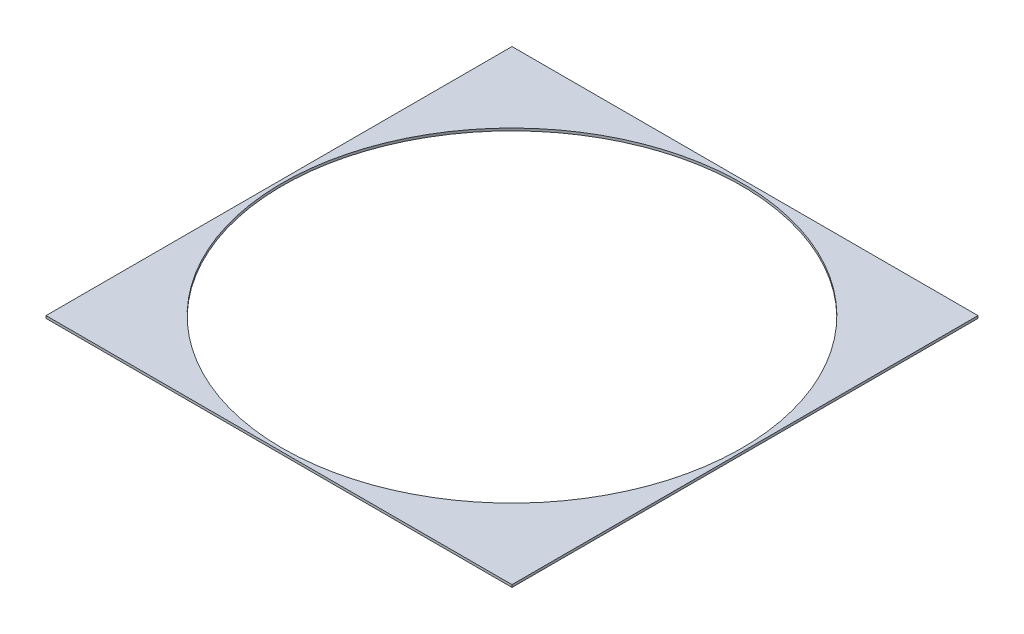
ISO-10303-21;
HEADER;
FILE_DESCRIPTION(('STEP AP214'),'2;1');
FILE_NAME('part.step','',(''),(''),'','','');
FILE_SCHEMA(('AUTOMOTIVE_DESIGN { 1 0 10303 214 1 1 1 1 }'));
ENDSEC;
DATA;
#1=APPLICATION_CONTEXT('core data for automotive mechanical design processes');
#2=APPLICATION_PROTOCOL_DEFINITION('international standard','automotive_design',2000,#1);
#3=PRODUCT_CONTEXT('',#1,'mechanical');
#4=PRODUCT('Part','Part','',(#3));
#5=PRODUCT_RELATED_PRODUCT_CATEGORY('part','',(#4));
#6=PRODUCT_DEFINITION_FORMATION('','',#4);
#7=PRODUCT_DEFINITION_CONTEXT('part definition',#1,'design');
#8=PRODUCT_DEFINITION('design','',#6,#7);
#9=PRODUCT_DEFINITION_SHAPE('','',#8);
#10=(LENGTH_UNIT() NAMED_UNIT(*) SI_UNIT(.MILLI.,.METRE.));
#11=(NAMED_UNIT(*) PLANE_ANGLE_UNIT() SI_UNIT($,.RADIAN.));
#12=(NAMED_UNIT(*) SI_UNIT($,.STERADIAN.) SOLID_ANGLE_UNIT());
#13=UNCERTAINTY_MEASURE_WITH_UNIT(LENGTH_MEASURE(1.E-05),#10,'distance_accuracy_value','');
#14=(GEOMETRIC_REPRESENTATION_CONTEXT(3) GLOBAL_UNCERTAINTY_ASSIGNED_CONTEXT((#13)) GLOBAL_UNIT_ASSIGNED_CONTEXT((#10,
#11,#12)) REPRESENTATION_CONTEXT('',''));
#15=CARTESIAN_POINT('',(0.,0.,0.));
#16=DIRECTION('',(0.,0.,1.));
#17=DIRECTION('',(1.,0.,0.));
#18=AXIS2_PLACEMENT_3D('',#15,#16,#17);
#19=CARTESIAN_POINT('',(0.,1.5,142.));
#20=DIRECTION('',(0.,0.,-1.));
#21=DIRECTION('',(-1.,0.,0.));
#22=AXIS2_PLACEMENT_3D('',#19,#20,#21);
#23=PLANE('',#22);
#24=DIRECTION('',(1.,0.,0.));
#25=VECTOR('',#24,1.);
#26=CARTESIAN_POINT('',(0.,0.,142.));
#27=LINE('',#26,#25);
#28=CARTESIAN_POINT('',(-142.,0.,142.));
#29=VERTEX_POINT('',#28);
#30=CARTESIAN_POINT('',(142.,0.,142.));
#31=VERTEX_POINT('',#30);
#32=EDGE_CURVE('E114',#29,#31,#27,.T.);
#33=ORIENTED_EDGE('',*,*,#32,.T.);
#34=DIRECTION('',(0.,-1.,0.));
#35=VECTOR('',#34,1.);
#36=CARTESIAN_POINT('',(142.,1.5,142.));
#37=LINE('',#36,#35);
#38=CARTESIAN_POINT('',(142.,1.5,142.));
#39=VERTEX_POINT('',#38);
#40=EDGE_CURVE('E11',#39,#31,#37,.T.);
#41=ORIENTED_EDGE('',*,*,#40,.F.);
#42=DIRECTION('',(1.,0.,0.));
#43=VECTOR('',#42,1.);
#44=CARTESIAN_POINT('',(0.,1.5,142.));
#45=LINE('',#44,#43);
#46=CARTESIAN_POINT('',(-142.,1.5,142.));
#47=VERTEX_POINT('',#46);
#48=EDGE_CURVE('E92',#47,#39,#45,.T.);
#49=ORIENTED_EDGE('',*,*,#48,.F.);
#50=DIRECTION('',(0.,-1.,0.));
#51=VECTOR('',#50,1.);
#52=CARTESIAN_POINT('',(-142.,1.5,142.));
#53=LINE('',#52,#51);
#54=EDGE_CURVE('E59',#47,#29,#53,.T.);
#55=ORIENTED_EDGE('',*,*,#54,.T.);
#56=EDGE_LOOP('',(#33,#41,#49,#55));
#57=FACE_BOUND('',#56,.T.);
#58=ADVANCED_FACE('F41',(#57),#23,.F.);
#59=CARTESIAN_POINT('',(142.,1.5,0.));
#60=DIRECTION('',(-1.,0.,0.));
#61=DIRECTION('',(0.,0.,1.));
#62=AXIS2_PLACEMENT_3D('',#59,#60,#61);
#63=PLANE('',#62);
#64=DIRECTION('',(0.,0.,-1.));
#65=VECTOR('',#64,1.);
#66=CARTESIAN_POINT('',(142.,0.,0.));
#67=LINE('',#66,#65);
#68=CARTESIAN_POINT('',(142.,0.,-142.));
#69=VERTEX_POINT('',#68);
#70=EDGE_CURVE('E98',#31,#69,#67,.T.);
#71=ORIENTED_EDGE('',*,*,#70,.T.);
#72=DIRECTION('',(0.,-1.,0.));
#73=VECTOR('',#72,1.);
#74=CARTESIAN_POINT('',(142.,1.5,-142.));
#75=LINE('',#74,#73);
#76=CARTESIAN_POINT('',(142.,1.5,-142.));
#77=VERTEX_POINT('',#76);
#78=EDGE_CURVE('E51',#77,#69,#75,.T.);
#79=ORIENTED_EDGE('',*,*,#78,.F.);
#80=DIRECTION('',(0.,0.,-1.));
#81=VECTOR('',#80,1.);
#82=CARTESIAN_POINT('',(142.,1.5,0.));
#83=LINE('',#82,#81);
#84=EDGE_CURVE('E84',#39,#77,#83,.T.);
#85=ORIENTED_EDGE('',*,*,#84,.F.);
#86=ORIENTED_EDGE('',*,*,#40,.T.);
#87=EDGE_LOOP('',(#71,#79,#85,#86));
#88=FACE_BOUND('',#87,.T.);
#89=ADVANCED_FACE('F97',(#88),#63,.F.);
#90=CARTESIAN_POINT('',(0.,1.5,-142.));
#91=DIRECTION('',(0.,0.,-1.));
#92=DIRECTION('',(-1.,0.,0.));
#93=AXIS2_PLACEMENT_3D('',#90,#91,#92);
#94=PLANE('',#93);
#95=DIRECTION('',(1.,0.,0.));
#96=VECTOR('',#95,1.);
#97=CARTESIAN_POINT('',(0.,0.,-142.));
#98=LINE('',#97,#96);
#99=CARTESIAN_POINT('',(-142.,0.,-142.));
#100=VERTEX_POINT('',#99);
#101=EDGE_CURVE('E119',#100,#69,#98,.T.);
#102=ORIENTED_EDGE('',*,*,#101,.F.);
#103=DIRECTION('',(0.,-1.,0.));
#104=VECTOR('',#103,1.);
#105=CARTESIAN_POINT('',(-142.,1.5,-142.));
#106=LINE('',#105,#104);
#107=CARTESIAN_POINT('',(-142.,1.5,-142.));
#108=VERTEX_POINT('',#107);
#109=EDGE_CURVE('E73',#108,#100,#106,.T.);
#110=ORIENTED_EDGE('',*,*,#109,.F.);
#111=DIRECTION('',(1.,0.,0.));
#112=VECTOR('',#111,1.);
#113=CARTESIAN_POINT('',(0.,1.5,-142.));
#114=LINE('',#113,#112);
#115=EDGE_CURVE('E91',#108,#77,#114,.T.);
#116=ORIENTED_EDGE('',*,*,#115,.T.);
#117=ORIENTED_EDGE('',*,*,#78,.T.);
#118=EDGE_LOOP('',(#102,#110,#116,#117));
#119=FACE_BOUND('',#118,.T.);
#120=ADVANCED_FACE('F102',(#119),#94,.T.);
#121=CARTESIAN_POINT('',(0.,1.5,0.));
#122=DIRECTION('',(0.,-1.,0.));
#123=DIRECTION('',(0.,0.,-1.));
#124=AXIS2_PLACEMENT_3D('',#121,#122,#123);
#125=CYLINDRICAL_SURFACE('',#124,140.);
#126=CARTESIAN_POINT('',(0.,1.5,0.));
#127=DIRECTION('',(0.,1.,0.));
#128=DIRECTION('',(0.,0.,1.));
#129=AXIS2_PLACEMENT_3D('',#126,#127,#128);
#130=CIRCLE('',#129,140.);
#131=CARTESIAN_POINT('',(0.,1.5,140.));
#132=VERTEX_POINT('',#131);
#133=EDGE_CURVE('E126',#132,#132,#130,.T.);
#134=ORIENTED_EDGE('',*,*,#133,.T.);
#135=EDGE_LOOP('',(#134));
#136=FACE_BOUND('',#135,.T.);
#137=CARTESIAN_POINT('',(0.,0.,0.));
#138=DIRECTION('',(0.,1.,0.));
#139=DIRECTION('',(0.,0.,1.));
#140=AXIS2_PLACEMENT_3D('',#137,#138,#139);
#141=CIRCLE('',#140,140.);
#142=CARTESIAN_POINT('',(0.,0.,140.));
#143=VERTEX_POINT('',#142);
#144=EDGE_CURVE('E110',#143,#143,#141,.T.);
#145=ORIENTED_EDGE('',*,*,#144,.F.);
#146=EDGE_LOOP('',(#145));
#147=FACE_BOUND('',#146,.T.);
#148=ADVANCED_FACE('F43',(#136,#147),#125,.F.);
#149=CARTESIAN_POINT('',(-142.,1.5,0.));
#150=DIRECTION('',(-1.,0.,0.));
#151=DIRECTION('',(0.,0.,1.));
#152=AXIS2_PLACEMENT_3D('',#149,#150,#151);
#153=PLANE('',#152);
#154=DIRECTION('',(0.,0.,-1.));
#155=VECTOR('',#154,1.);
#156=CARTESIAN_POINT('',(-142.,0.,0.));
#157=LINE('',#156,#155);
#158=EDGE_CURVE('E122',#29,#100,#157,.T.);
#159=ORIENTED_EDGE('',*,*,#158,.F.);
#160=ORIENTED_EDGE('',*,*,#54,.F.);
#161=DIRECTION('',(0.,0.,-1.));
#162=VECTOR('',#161,1.);
#163=CARTESIAN_POINT('',(-142.,1.5,0.));
#164=LINE('',#163,#162);
#165=EDGE_CURVE('E104',#47,#108,#164,.T.);
#166=ORIENTED_EDGE('',*,*,#165,.T.);
#167=ORIENTED_EDGE('',*,*,#109,.T.);
#168=EDGE_LOOP('',(#159,#160,#166,#167));
#169=FACE_BOUND('',#168,.T.);
#170=ADVANCED_FACE('F141',(#169),#153,.T.);
#171=CARTESIAN_POINT('',(0.,1.5,0.));
#172=DIRECTION('',(0.,1.,0.));
#173=DIRECTION('',(0.,0.,1.));
#174=AXIS2_PLACEMENT_3D('',#171,#172,#173);
#175=PLANE('',#174);
#176=ORIENTED_EDGE('',*,*,#133,.F.);
#177=EDGE_LOOP('',(#176));
#178=FACE_BOUND('',#177,.T.);
#179=ORIENTED_EDGE('',*,*,#48,.T.);
#180=ORIENTED_EDGE('',*,*,#84,.T.);
#181=ORIENTED_EDGE('',*,*,#115,.F.);
#182=ORIENTED_EDGE('',*,*,#165,.F.);
#183=EDGE_LOOP('',(#179,#180,#181,#182));
#184=FACE_BOUND('',#183,.T.);
#185=ADVANCED_FACE('F88',(#178,#184),#175,.T.);
#186=CARTESIAN_POINT('',(0.,0.,0.));
#187=DIRECTION('',(0.,1.,0.));
#188=DIRECTION('',(0.,0.,1.));
#189=AXIS2_PLACEMENT_3D('',#186,#187,#188);
#190=PLANE('',#189);
#191=ORIENTED_EDGE('',*,*,#144,.T.);
#192=EDGE_LOOP('',(#191));
#193=FACE_BOUND('',#192,.T.);
#194=ORIENTED_EDGE('',*,*,#32,.F.);
#195=ORIENTED_EDGE('',*,*,#158,.T.);
#196=ORIENTED_EDGE('',*,*,#101,.T.);
#197=ORIENTED_EDGE('',*,*,#70,.F.);
#198=EDGE_LOOP('',(#194,#195,#196,#197));
#199=FACE_BOUND('',#198,.T.);
#200=ADVANCED_FACE('F140',(#193,#199),#190,.F.);
#201=CLOSED_SHELL('',(#58,#89,#120,#148,#170,#185,#200));
#202=MANIFOLD_SOLID_BREP('B2',#201);
#203=ADVANCED_BREP_SHAPE_REPRESENTATION('',(#18,#202),#14);
#204=SHAPE_DEFINITION_REPRESENTATION(#9,#203);
ENDSEC;
END-ISO-10303-21;
